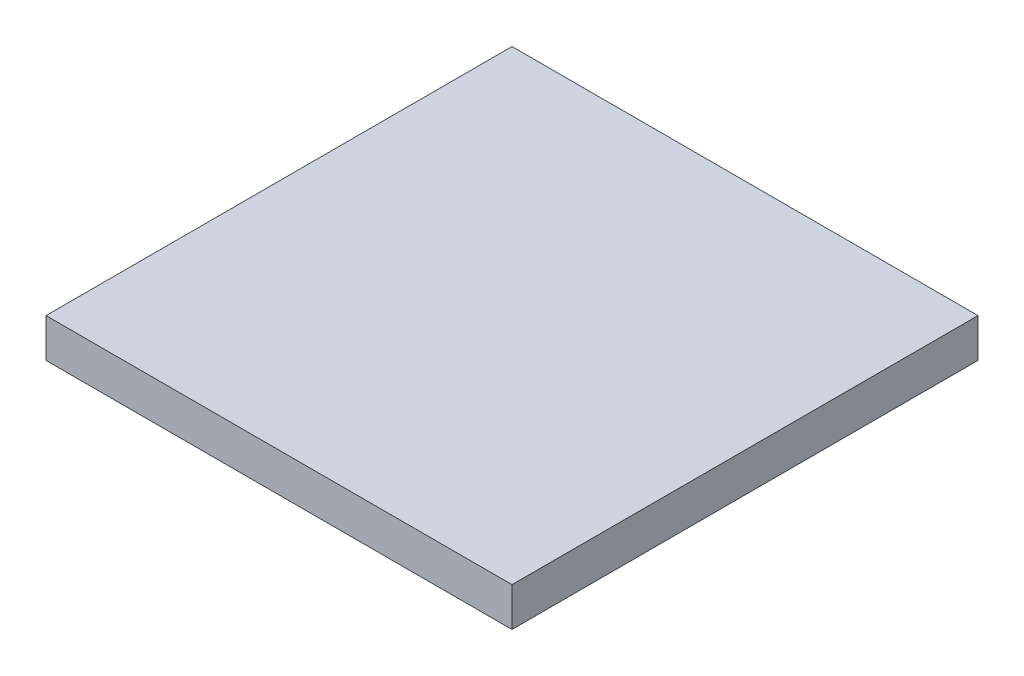
ISO-10303-21;
HEADER;
FILE_DESCRIPTION(('STEP AP214'),'2;1');
FILE_NAME('part.step','',(''),(''),'','','');
FILE_SCHEMA(('AUTOMOTIVE_DESIGN { 1 0 10303 214 1 1 1 1 }'));
ENDSEC;
DATA;
#1=APPLICATION_CONTEXT('core data for automotive mechanical design processes');
#2=APPLICATION_PROTOCOL_DEFINITION('international standard','automotive_design',2000,#1);
#3=PRODUCT_CONTEXT('',#1,'mechanical');
#4=PRODUCT('Part','Part','',(#3));
#5=PRODUCT_RELATED_PRODUCT_CATEGORY('part','',(#4));
#6=PRODUCT_DEFINITION_FORMATION('','',#4);
#7=PRODUCT_DEFINITION_CONTEXT('part definition',#1,'design');
#8=PRODUCT_DEFINITION('design','',#6,#7);
#9=PRODUCT_DEFINITION_SHAPE('','',#8);
#10=(LENGTH_UNIT() NAMED_UNIT(*) SI_UNIT(.MILLI.,.METRE.));
#11=(NAMED_UNIT(*) PLANE_ANGLE_UNIT() SI_UNIT($,.RADIAN.));
#12=(NAMED_UNIT(*) SI_UNIT($,.STERADIAN.) SOLID_ANGLE_UNIT());
#13=UNCERTAINTY_MEASURE_WITH_UNIT(LENGTH_MEASURE(1.E-05),#10,'distance_accuracy_value','');
#14=(GEOMETRIC_REPRESENTATION_CONTEXT(3) GLOBAL_UNCERTAINTY_ASSIGNED_CONTEXT((#13)) GLOBAL_UNIT_ASSIGNED_CONTEXT((#10,
#11,#12)) REPRESENTATION_CONTEXT('',''));
#15=CARTESIAN_POINT('',(0.,0.,0.));
#16=DIRECTION('',(0.,0.,1.));
#17=DIRECTION('',(1.,0.,0.));
#18=AXIS2_PLACEMENT_3D('',#15,#16,#17);
#19=CARTESIAN_POINT('',(152.4,25.4,152.4));
#20=DIRECTION('',(-1.,0.,0.));
#21=DIRECTION('',(0.,0.,1.));
#22=AXIS2_PLACEMENT_3D('',#19,#20,#21);
#23=PLANE('',#22);
#24=DIRECTION('',(0.,0.,-1.));
#25=VECTOR('',#24,1.);
#26=CARTESIAN_POINT('',(152.4,0.,152.4));
#27=LINE('',#26,#25);
#28=CARTESIAN_POINT('',(152.4,0.,152.4));
#29=VERTEX_POINT('',#28);
#30=CARTESIAN_POINT('',(152.4,0.,-152.4));
#31=VERTEX_POINT('',#30);
#32=EDGE_CURVE('E96',#29,#31,#27,.T.);
#33=ORIENTED_EDGE('',*,*,#32,.T.);
#34=DIRECTION('',(0.,-1.,0.));
#35=VECTOR('',#34,1.);
#36=CARTESIAN_POINT('',(152.4,25.4,-152.4));
#37=LINE('',#36,#35);
#38=CARTESIAN_POINT('',(152.4,25.4,-152.4));
#39=VERTEX_POINT('',#38);
#40=EDGE_CURVE('E11',#39,#31,#37,.T.);
#41=ORIENTED_EDGE('',*,*,#40,.F.);
#42=DIRECTION('',(0.,0.,-1.));
#43=VECTOR('',#42,1.);
#44=CARTESIAN_POINT('',(152.4,25.4,152.4));
#45=LINE('',#44,#43);
#46=CARTESIAN_POINT('',(152.4,25.4,152.4));
#47=VERTEX_POINT('',#46);
#48=EDGE_CURVE('E84',#47,#39,#45,.T.);
#49=ORIENTED_EDGE('',*,*,#48,.F.);
#50=DIRECTION('',(0.,-1.,0.));
#51=VECTOR('',#50,1.);
#52=CARTESIAN_POINT('',(152.4,25.4,152.4));
#53=LINE('',#52,#51);
#54=EDGE_CURVE('E92',#47,#29,#53,.T.);
#55=ORIENTED_EDGE('',*,*,#54,.T.);
#56=EDGE_LOOP('',(#33,#41,#49,#55));
#57=FACE_BOUND('',#56,.T.);
#58=ADVANCED_FACE('F33',(#57),#23,.F.);
#59=CARTESIAN_POINT('',(-152.4,25.4,-152.4));
#60=DIRECTION('',(0.,0.,1.));
#61=DIRECTION('',(1.,0.,0.));
#62=AXIS2_PLACEMENT_3D('',#59,#60,#61);
#63=PLANE('',#62);
#64=DIRECTION('',(-1.,0.,0.));
#65=VECTOR('',#64,1.);
#66=CARTESIAN_POINT('',(-152.4,0.,-152.4));
#67=LINE('',#66,#65);
#68=CARTESIAN_POINT('',(-152.4,0.,-152.4));
#69=VERTEX_POINT('',#68);
#70=EDGE_CURVE('E88',#31,#69,#67,.T.);
#71=ORIENTED_EDGE('',*,*,#70,.T.);
#72=DIRECTION('',(0.,-1.,0.));
#73=VECTOR('',#72,1.);
#74=CARTESIAN_POINT('',(-152.4,25.4,-152.4));
#75=LINE('',#74,#73);
#76=CARTESIAN_POINT('',(-152.4,25.4,-152.4));
#77=VERTEX_POINT('',#76);
#78=EDGE_CURVE('E41',#77,#69,#75,.T.);
#79=ORIENTED_EDGE('',*,*,#78,.F.);
#80=DIRECTION('',(-1.,0.,0.));
#81=VECTOR('',#80,1.);
#82=CARTESIAN_POINT('',(-152.4,25.4,-152.4));
#83=LINE('',#82,#81);
#84=EDGE_CURVE('E79',#39,#77,#83,.T.);
#85=ORIENTED_EDGE('',*,*,#84,.F.);
#86=ORIENTED_EDGE('',*,*,#40,.T.);
#87=EDGE_LOOP('',(#71,#79,#85,#86));
#88=FACE_BOUND('',#87,.T.);
#89=ADVANCED_FACE('F87',(#88),#63,.F.);
#90=CARTESIAN_POINT('',(-152.4,25.4,152.4));
#91=DIRECTION('',(1.,0.,0.));
#92=DIRECTION('',(0.,0.,-1.));
#93=AXIS2_PLACEMENT_3D('',#90,#91,#92);
#94=PLANE('',#93);
#95=DIRECTION('',(0.,0.,1.));
#96=VECTOR('',#95,1.);
#97=CARTESIAN_POINT('',(-152.4,0.,152.4));
#98=LINE('',#97,#96);
#99=CARTESIAN_POINT('',(-152.4,0.,152.4));
#100=VERTEX_POINT('',#99);
#101=EDGE_CURVE('E66',#69,#100,#98,.T.);
#102=ORIENTED_EDGE('',*,*,#101,.T.);
#103=DIRECTION('',(0.,-1.,0.));
#104=VECTOR('',#103,1.);
#105=CARTESIAN_POINT('',(-152.4,25.4,152.4));
#106=LINE('',#105,#104);
#107=CARTESIAN_POINT('',(-152.4,25.4,152.4));
#108=VERTEX_POINT('',#107);
#109=EDGE_CURVE('E89',#108,#100,#106,.T.);
#110=ORIENTED_EDGE('',*,*,#109,.F.);
#111=DIRECTION('',(0.,0.,1.));
#112=VECTOR('',#111,1.);
#113=CARTESIAN_POINT('',(-152.4,25.4,152.4));
#114=LINE('',#113,#112);
#115=EDGE_CURVE('E82',#77,#108,#114,.T.);
#116=ORIENTED_EDGE('',*,*,#115,.F.);
#117=ORIENTED_EDGE('',*,*,#78,.T.);
#118=EDGE_LOOP('',(#102,#110,#116,#117));
#119=FACE_BOUND('',#118,.T.);
#120=ADVANCED_FACE('F90',(#119),#94,.F.);
#121=CARTESIAN_POINT('',(-152.4,25.4,152.4));
#122=DIRECTION('',(0.,0.,-1.));
#123=DIRECTION('',(-1.,0.,0.));
#124=AXIS2_PLACEMENT_3D('',#121,#122,#123);
#125=PLANE('',#124);
#126=DIRECTION('',(1.,0.,0.));
#127=VECTOR('',#126,1.);
#128=CARTESIAN_POINT('',(-152.4,0.,152.4));
#129=LINE('',#128,#127);
#130=EDGE_CURVE('E72',#100,#29,#129,.T.);
#131=ORIENTED_EDGE('',*,*,#130,.T.);
#132=ORIENTED_EDGE('',*,*,#54,.F.);
#133=DIRECTION('',(1.,0.,0.));
#134=VECTOR('',#133,1.);
#135=CARTESIAN_POINT('',(-152.4,25.4,152.4));
#136=LINE('',#135,#134);
#137=EDGE_CURVE('E49',#108,#47,#136,.T.);
#138=ORIENTED_EDGE('',*,*,#137,.F.);
#139=ORIENTED_EDGE('',*,*,#109,.T.);
#140=EDGE_LOOP('',(#131,#132,#138,#139));
#141=FACE_BOUND('',#140,.T.);
#142=ADVANCED_FACE('F103',(#141),#125,.F.);
#143=CARTESIAN_POINT('',(0.,25.4,0.));
#144=DIRECTION('',(0.,-1.,0.));
#145=DIRECTION('',(0.,0.,-1.));
#146=AXIS2_PLACEMENT_3D('',#143,#144,#145);
#147=PLANE('',#146);
#148=ORIENTED_EDGE('',*,*,#48,.T.);
#149=ORIENTED_EDGE('',*,*,#84,.T.);
#150=ORIENTED_EDGE('',*,*,#115,.T.);
#151=ORIENTED_EDGE('',*,*,#137,.T.);
#152=EDGE_LOOP('',(#148,#149,#150,#151));
#153=FACE_BOUND('',#152,.T.);
#154=ADVANCED_FACE('F80',(#153),#147,.F.);
#155=CARTESIAN_POINT('',(0.,0.,0.));
#156=DIRECTION('',(0.,-1.,0.));
#157=DIRECTION('',(0.,0.,-1.));
#158=AXIS2_PLACEMENT_3D('',#155,#156,#157);
#159=PLANE('',#158);
#160=ORIENTED_EDGE('',*,*,#32,.F.);
#161=ORIENTED_EDGE('',*,*,#130,.F.);
#162=ORIENTED_EDGE('',*,*,#101,.F.);
#163=ORIENTED_EDGE('',*,*,#70,.F.);
#164=EDGE_LOOP('',(#160,#161,#162,#163));
#165=FACE_BOUND('',#164,.T.);
#166=ADVANCED_FACE('F106',(#165),#159,.T.);
#167=CLOSED_SHELL('',(#58,#89,#120,#142,#154,#166));
#168=MANIFOLD_SOLID_BREP('B2',#167);
#169=ADVANCED_BREP_SHAPE_REPRESENTATION('',(#18,#168),#14);
#170=SHAPE_DEFINITION_REPRESENTATION(#9,#169);
ENDSEC;
END-ISO-10303-21;
